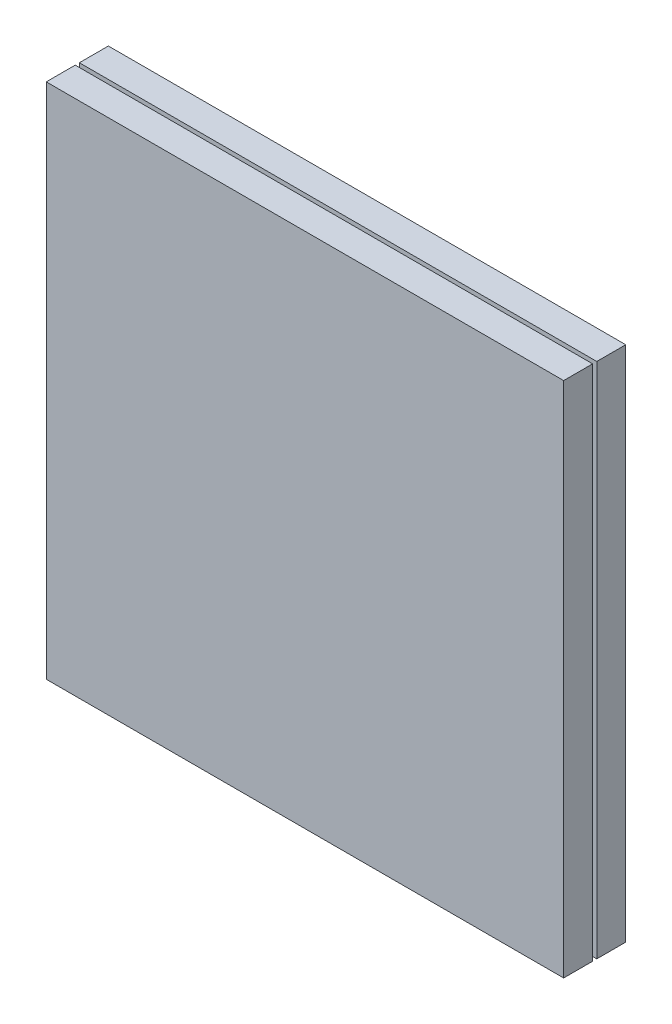
ISO-10303-21;
HEADER;
FILE_DESCRIPTION(('STEP AP214'),'2;1');
FILE_NAME('part.step','',(''),(''),'','','');
FILE_SCHEMA(('AUTOMOTIVE_DESIGN { 1 0 10303 214 1 1 1 1 }'));
ENDSEC;
DATA;
#1=APPLICATION_CONTEXT('core data for automotive mechanical design processes');
#2=APPLICATION_PROTOCOL_DEFINITION('international standard','automotive_design',2000,#1);
#3=PRODUCT_CONTEXT('',#1,'mechanical');
#4=PRODUCT('Part','Part','',(#3));
#5=PRODUCT_RELATED_PRODUCT_CATEGORY('part','',(#4));
#6=PRODUCT_DEFINITION_FORMATION('','',#4);
#7=PRODUCT_DEFINITION_CONTEXT('part definition',#1,'design');
#8=PRODUCT_DEFINITION('design','',#6,#7);
#9=PRODUCT_DEFINITION_SHAPE('','',#8);
#10=(LENGTH_UNIT() NAMED_UNIT(*) SI_UNIT(.MILLI.,.METRE.));
#11=(NAMED_UNIT(*) PLANE_ANGLE_UNIT() SI_UNIT($,.RADIAN.));
#12=(NAMED_UNIT(*) SI_UNIT($,.STERADIAN.) SOLID_ANGLE_UNIT());
#13=UNCERTAINTY_MEASURE_WITH_UNIT(LENGTH_MEASURE(1.E-05),#10,'distance_accuracy_value','');
#14=(GEOMETRIC_REPRESENTATION_CONTEXT(3) GLOBAL_UNCERTAINTY_ASSIGNED_CONTEXT((#13)) GLOBAL_UNIT_ASSIGNED_CONTEXT((#10,
#11,#12)) REPRESENTATION_CONTEXT('',''));
#15=CARTESIAN_POINT('',(0.,0.,0.));
#16=DIRECTION('',(0.,0.,1.));
#17=DIRECTION('',(1.,0.,0.));
#18=AXIS2_PLACEMENT_3D('',#15,#16,#17);
#19=CARTESIAN_POINT('',(6.25000000000001,-6.25,-0.7));
#20=DIRECTION('',(1.,0.,0.));
#21=DIRECTION('',(0.,0.,-1.));
#22=AXIS2_PLACEMENT_3D('',#19,#20,#21);
#23=PLANE('',#22);
#24=DIRECTION('',(0.,1.,0.));
#25=VECTOR('',#24,1.);
#26=CARTESIAN_POINT('',(6.25000000000001,-6.25,0.));
#27=LINE('',#26,#25);
#28=CARTESIAN_POINT('',(6.25000000000001,-6.25,0.));
#29=VERTEX_POINT('',#28);
#30=CARTESIAN_POINT('',(6.25000000000001,6.25,0.));
#31=VERTEX_POINT('',#30);
#32=EDGE_CURVE('E164',#29,#31,#27,.T.);
#33=ORIENTED_EDGE('',*,*,#32,.F.);
#34=DIRECTION('',(0.,0.,1.));
#35=VECTOR('',#34,1.);
#36=CARTESIAN_POINT('',(6.25000000000001,-6.25,-0.7));
#37=LINE('',#36,#35);
#38=CARTESIAN_POINT('',(6.25000000000001,-6.25,-0.7));
#39=VERTEX_POINT('',#38);
#40=EDGE_CURVE('E11',#39,#29,#37,.T.);
#41=ORIENTED_EDGE('',*,*,#40,.F.);
#42=DIRECTION('',(0.,1.,0.));
#43=VECTOR('',#42,1.);
#44=CARTESIAN_POINT('',(6.25000000000001,-6.25,-0.7));
#45=LINE('',#44,#43);
#46=CARTESIAN_POINT('',(6.25000000000001,6.25,-0.7));
#47=VERTEX_POINT('',#46);
#48=EDGE_CURVE('E165',#39,#47,#45,.T.);
#49=ORIENTED_EDGE('',*,*,#48,.T.);
#50=DIRECTION('',(0.,0.,1.));
#51=VECTOR('',#50,1.);
#52=CARTESIAN_POINT('',(6.25000000000001,6.25,-0.7));
#53=LINE('',#52,#51);
#54=EDGE_CURVE('E19',#47,#31,#53,.T.);
#55=ORIENTED_EDGE('',*,*,#54,.T.);
#56=EDGE_LOOP('',(#33,#41,#49,#55));
#57=FACE_BOUND('',#56,.T.);
#58=ADVANCED_FACE('F16',(#57),#23,.T.);
#59=CARTESIAN_POINT('',(-6.24999999999998,-6.25,-0.7));
#60=DIRECTION('',(0.,-1.,0.));
#61=DIRECTION('',(0.,0.,-1.));
#62=AXIS2_PLACEMENT_3D('',#59,#60,#61);
#63=PLANE('',#62);
#64=DIRECTION('',(1.,0.,0.));
#65=VECTOR('',#64,1.);
#66=CARTESIAN_POINT('',(-6.24999999999998,-6.25,0.));
#67=LINE('',#66,#65);
#68=CARTESIAN_POINT('',(-6.24999999999998,-6.25,0.));
#69=VERTEX_POINT('',#68);
#70=EDGE_CURVE('E169',#69,#29,#67,.T.);
#71=ORIENTED_EDGE('',*,*,#70,.F.);
#72=DIRECTION('',(0.,0.,1.));
#73=VECTOR('',#72,1.);
#74=CARTESIAN_POINT('',(-6.24999999999998,-6.25,-0.7));
#75=LINE('',#74,#73);
#76=CARTESIAN_POINT('',(-6.24999999999998,-6.25,-0.7));
#77=VERTEX_POINT('',#76);
#78=EDGE_CURVE('E24',#77,#69,#75,.T.);
#79=ORIENTED_EDGE('',*,*,#78,.F.);
#80=DIRECTION('',(1.,0.,0.));
#81=VECTOR('',#80,1.);
#82=CARTESIAN_POINT('',(-6.24999999999998,-6.25,-0.7));
#83=LINE('',#82,#81);
#84=EDGE_CURVE('E175',#77,#39,#83,.T.);
#85=ORIENTED_EDGE('',*,*,#84,.T.);
#86=ORIENTED_EDGE('',*,*,#40,.T.);
#87=EDGE_LOOP('',(#71,#79,#85,#86));
#88=FACE_BOUND('',#87,.T.);
#89=ADVANCED_FACE('F201',(#88),#63,.T.);
#90=CARTESIAN_POINT('',(-6.24999999999998,-6.25,-0.7));
#91=DIRECTION('',(-1.,0.,0.));
#92=DIRECTION('',(0.,0.,1.));
#93=AXIS2_PLACEMENT_3D('',#90,#91,#92);
#94=PLANE('',#93);
#95=DIRECTION('',(0.,-1.,0.));
#96=VECTOR('',#95,1.);
#97=CARTESIAN_POINT('',(-6.24999999999998,-6.25,0.));
#98=LINE('',#97,#96);
#99=CARTESIAN_POINT('',(-6.24999999999998,6.25,0.));
#100=VERTEX_POINT('',#99);
#101=EDGE_CURVE('E183',#100,#69,#98,.T.);
#102=ORIENTED_EDGE('',*,*,#101,.F.);
#103=DIRECTION('',(0.,0.,1.));
#104=VECTOR('',#103,1.);
#105=CARTESIAN_POINT('',(-6.24999999999998,6.25,-0.7));
#106=LINE('',#105,#104);
#107=CARTESIAN_POINT('',(-6.24999999999998,6.25,-0.7));
#108=VERTEX_POINT('',#107);
#109=EDGE_CURVE('E188',#108,#100,#106,.T.);
#110=ORIENTED_EDGE('',*,*,#109,.F.);
#111=DIRECTION('',(0.,-1.,0.));
#112=VECTOR('',#111,1.);
#113=CARTESIAN_POINT('',(-6.24999999999998,-6.25,-0.7));
#114=LINE('',#113,#112);
#115=EDGE_CURVE('E172',#108,#77,#114,.T.);
#116=ORIENTED_EDGE('',*,*,#115,.T.);
#117=ORIENTED_EDGE('',*,*,#78,.T.);
#118=EDGE_LOOP('',(#102,#110,#116,#117));
#119=FACE_BOUND('',#118,.T.);
#120=ADVANCED_FACE('F207',(#119),#94,.T.);
#121=CARTESIAN_POINT('',(-6.24999999999998,6.25,-0.7));
#122=DIRECTION('',(0.,1.,0.));
#123=DIRECTION('',(0.,0.,1.));
#124=AXIS2_PLACEMENT_3D('',#121,#122,#123);
#125=PLANE('',#124);
#126=DIRECTION('',(-1.,0.,0.));
#127=VECTOR('',#126,1.);
#128=CARTESIAN_POINT('',(-6.24999999999998,6.25,0.));
#129=LINE('',#128,#127);
#130=EDGE_CURVE('E180',#31,#100,#129,.T.);
#131=ORIENTED_EDGE('',*,*,#130,.F.);
#132=ORIENTED_EDGE('',*,*,#54,.F.);
#133=DIRECTION('',(-1.,0.,0.));
#134=VECTOR('',#133,1.);
#135=CARTESIAN_POINT('',(-6.24999999999998,6.25,-0.7));
#136=LINE('',#135,#134);
#137=EDGE_CURVE('E168',#47,#108,#136,.T.);
#138=ORIENTED_EDGE('',*,*,#137,.T.);
#139=ORIENTED_EDGE('',*,*,#109,.T.);
#140=EDGE_LOOP('',(#131,#132,#138,#139));
#141=FACE_BOUND('',#140,.T.);
#142=ADVANCED_FACE('F196',(#141),#125,.T.);
#143=CARTESIAN_POINT('',(0.,0.,-0.7));
#144=DIRECTION('',(0.,0.,-1.));
#145=DIRECTION('',(-1.,0.,0.));
#146=AXIS2_PLACEMENT_3D('',#143,#144,#145);
#147=PLANE('',#146);
#148=DIRECTION('',(0.,1.,0.));
#149=VECTOR('',#148,1.);
#150=CARTESIAN_POINT('',(-5.25,-5.25,-0.7));
#151=LINE('',#150,#149);
#152=CARTESIAN_POINT('',(-5.25,-5.25,-0.7));
#153=VERTEX_POINT('',#152);
#154=CARTESIAN_POINT('',(-5.25,5.25,-0.7));
#155=VERTEX_POINT('',#154);
#156=EDGE_CURVE('E32',#153,#155,#151,.T.);
#157=ORIENTED_EDGE('',*,*,#156,.F.);
#158=DIRECTION('',(-1.,0.,0.));
#159=VECTOR('',#158,1.);
#160=CARTESIAN_POINT('',(5.25,-5.25,-0.7));
#161=LINE('',#160,#159);
#162=CARTESIAN_POINT('',(5.25,-5.25,-0.7));
#163=VERTEX_POINT('',#162);
#164=EDGE_CURVE('E36',#163,#153,#161,.T.);
#165=ORIENTED_EDGE('',*,*,#164,.F.);
#166=DIRECTION('',(0.,-1.,0.));
#167=VECTOR('',#166,1.);
#168=CARTESIAN_POINT('',(5.25,-5.25,-0.7));
#169=LINE('',#168,#167);
#170=CARTESIAN_POINT('',(5.25,5.25,-0.7));
#171=VERTEX_POINT('',#170);
#172=EDGE_CURVE('E150',#171,#163,#169,.T.);
#173=ORIENTED_EDGE('',*,*,#172,.F.);
#174=DIRECTION('',(1.,0.,0.));
#175=VECTOR('',#174,1.);
#176=CARTESIAN_POINT('',(5.25,5.25,-0.7));
#177=LINE('',#176,#175);
#178=EDGE_CURVE('E129',#155,#171,#177,.T.);
#179=ORIENTED_EDGE('',*,*,#178,.F.);
#180=EDGE_LOOP('',(#157,#165,#173,#179));
#181=FACE_BOUND('',#180,.T.);
#182=ORIENTED_EDGE('',*,*,#48,.F.);
#183=ORIENTED_EDGE('',*,*,#84,.F.);
#184=ORIENTED_EDGE('',*,*,#115,.F.);
#185=ORIENTED_EDGE('',*,*,#137,.F.);
#186=EDGE_LOOP('',(#182,#183,#184,#185));
#187=FACE_BOUND('',#186,.T.);
#188=ADVANCED_FACE('F204',(#181,#187),#147,.T.);
#189=CARTESIAN_POINT('',(0.,0.,0.));
#190=DIRECTION('',(0.,0.,-1.));
#191=DIRECTION('',(-1.,0.,0.));
#192=AXIS2_PLACEMENT_3D('',#189,#190,#191);
#193=PLANE('',#192);
#194=ORIENTED_EDGE('',*,*,#32,.T.);
#195=ORIENTED_EDGE('',*,*,#130,.T.);
#196=ORIENTED_EDGE('',*,*,#101,.T.);
#197=ORIENTED_EDGE('',*,*,#70,.T.);
#198=EDGE_LOOP('',(#194,#195,#196,#197));
#199=FACE_BOUND('',#198,.T.);
#200=ADVANCED_FACE('F198',(#199),#193,.F.);
#201=CARTESIAN_POINT('',(-5.25,-5.25,-0.8));
#202=DIRECTION('',(1.,0.,0.));
#203=DIRECTION('',(0.,0.,-1.));
#204=AXIS2_PLACEMENT_3D('',#201,#202,#203);
#205=PLANE('',#204);
#206=ORIENTED_EDGE('',*,*,#156,.T.);
#207=DIRECTION('',(0.,0.,1.));
#208=VECTOR('',#207,1.);
#209=CARTESIAN_POINT('',(-5.25,5.25,-0.8));
#210=LINE('',#209,#208);
#211=CARTESIAN_POINT('',(-5.25,5.25,-0.8));
#212=VERTEX_POINT('',#211);
#213=EDGE_CURVE('E161',#212,#155,#210,.T.);
#214=ORIENTED_EDGE('',*,*,#213,.F.);
#215=DIRECTION('',(0.,1.,0.));
#216=VECTOR('',#215,1.);
#217=CARTESIAN_POINT('',(-5.25,-5.25,-0.8));
#218=LINE('',#217,#216);
#219=CARTESIAN_POINT('',(-5.25,-5.25,-0.8));
#220=VERTEX_POINT('',#219);
#221=EDGE_CURVE('E135',#220,#212,#218,.T.);
#222=ORIENTED_EDGE('',*,*,#221,.F.);
#223=DIRECTION('',(0.,0.,1.));
#224=VECTOR('',#223,1.);
#225=CARTESIAN_POINT('',(-5.25,-5.25,-0.8));
#226=LINE('',#225,#224);
#227=EDGE_CURVE('E146',#220,#153,#226,.T.);
#228=ORIENTED_EDGE('',*,*,#227,.T.);
#229=EDGE_LOOP('',(#206,#214,#222,#228));
#230=FACE_BOUND('',#229,.T.);
#231=ADVANCED_FACE('F258',(#230),#205,.F.);
#232=CARTESIAN_POINT('',(5.25,5.25,-0.8));
#233=DIRECTION('',(0.,-1.,0.));
#234=DIRECTION('',(0.,0.,-1.));
#235=AXIS2_PLACEMENT_3D('',#232,#233,#234);
#236=PLANE('',#235);
#237=ORIENTED_EDGE('',*,*,#178,.T.);
#238=DIRECTION('',(0.,0.,1.));
#239=VECTOR('',#238,1.);
#240=CARTESIAN_POINT('',(5.25,5.25,-0.8));
#241=LINE('',#240,#239);
#242=CARTESIAN_POINT('',(5.25,5.25,-0.8));
#243=VERTEX_POINT('',#242);
#244=EDGE_CURVE('E158',#243,#171,#241,.T.);
#245=ORIENTED_EDGE('',*,*,#244,.F.);
#246=DIRECTION('',(1.,0.,0.));
#247=VECTOR('',#246,1.);
#248=CARTESIAN_POINT('',(5.25,5.25,-0.8));
#249=LINE('',#248,#247);
#250=EDGE_CURVE('E138',#212,#243,#249,.T.);
#251=ORIENTED_EDGE('',*,*,#250,.F.);
#252=ORIENTED_EDGE('',*,*,#213,.T.);
#253=EDGE_LOOP('',(#237,#245,#251,#252));
#254=FACE_BOUND('',#253,.T.);
#255=ADVANCED_FACE('F266',(#254),#236,.F.);
#256=CARTESIAN_POINT('',(5.25,-5.25,-0.8));
#257=DIRECTION('',(-1.,0.,0.));
#258=DIRECTION('',(0.,0.,1.));
#259=AXIS2_PLACEMENT_3D('',#256,#257,#258);
#260=PLANE('',#259);
#261=ORIENTED_EDGE('',*,*,#172,.T.);
#262=DIRECTION('',(0.,0.,1.));
#263=VECTOR('',#262,1.);
#264=CARTESIAN_POINT('',(5.25,-5.25,-0.8));
#265=LINE('',#264,#263);
#266=CARTESIAN_POINT('',(5.25,-5.25,-0.8));
#267=VERTEX_POINT('',#266);
#268=EDGE_CURVE('E155',#267,#163,#265,.T.);
#269=ORIENTED_EDGE('',*,*,#268,.F.);
#270=DIRECTION('',(0.,-1.,0.));
#271=VECTOR('',#270,1.);
#272=CARTESIAN_POINT('',(5.25,-5.25,-0.8));
#273=LINE('',#272,#271);
#274=EDGE_CURVE('E141',#243,#267,#273,.T.);
#275=ORIENTED_EDGE('',*,*,#274,.F.);
#276=ORIENTED_EDGE('',*,*,#244,.T.);
#277=EDGE_LOOP('',(#261,#269,#275,#276));
#278=FACE_BOUND('',#277,.T.);
#279=ADVANCED_FACE('F276',(#278),#260,.F.);
#280=CARTESIAN_POINT('',(5.25,-5.25,-0.8));
#281=DIRECTION('',(0.,1.,0.));
#282=DIRECTION('',(0.,0.,1.));
#283=AXIS2_PLACEMENT_3D('',#280,#281,#282);
#284=PLANE('',#283);
#285=ORIENTED_EDGE('',*,*,#164,.T.);
#286=ORIENTED_EDGE('',*,*,#227,.F.);
#287=DIRECTION('',(-1.,0.,0.));
#288=VECTOR('',#287,1.);
#289=CARTESIAN_POINT('',(5.25,-5.25,-0.8));
#290=LINE('',#289,#288);
#291=EDGE_CURVE('E144',#267,#220,#290,.T.);
#292=ORIENTED_EDGE('',*,*,#291,.F.);
#293=ORIENTED_EDGE('',*,*,#268,.T.);
#294=EDGE_LOOP('',(#285,#286,#292,#293));
#295=FACE_BOUND('',#294,.T.);
#296=ADVANCED_FACE('F286',(#295),#284,.F.);
#297=CARTESIAN_POINT('',(-6.24999999999998,-6.25,-1.5));
#298=DIRECTION('',(1.,0.,0.));
#299=DIRECTION('',(0.,0.,-1.));
#300=AXIS2_PLACEMENT_3D('',#297,#298,#299);
#301=PLANE('',#300);
#302=DIRECTION('',(0.,1.,0.));
#303=VECTOR('',#302,1.);
#304=CARTESIAN_POINT('',(-6.24999999999998,-6.25,-0.8));
#305=LINE('',#304,#303);
#306=CARTESIAN_POINT('',(-6.24999999999998,-6.25,-0.8));
#307=VERTEX_POINT('',#306);
#308=CARTESIAN_POINT('',(-6.24999999999998,6.25,-0.8));
#309=VERTEX_POINT('',#308);
#310=EDGE_CURVE('E127',#307,#309,#305,.T.);
#311=ORIENTED_EDGE('',*,*,#310,.T.);
#312=DIRECTION('',(0.,0.,1.));
#313=VECTOR('',#312,1.);
#314=CARTESIAN_POINT('',(-6.24999999999998,6.25,-1.5));
#315=LINE('',#314,#313);
#316=CARTESIAN_POINT('',(-6.24999999999998,6.25,-1.5));
#317=VERTEX_POINT('',#316);
#318=EDGE_CURVE('E107',#317,#309,#315,.T.);
#319=ORIENTED_EDGE('',*,*,#318,.F.);
#320=DIRECTION('',(0.,1.,0.));
#321=VECTOR('',#320,1.);
#322=CARTESIAN_POINT('',(-6.24999999999998,-6.25,-1.5));
#323=LINE('',#322,#321);
#324=CARTESIAN_POINT('',(-6.24999999999998,-6.25,-1.5));
#325=VERTEX_POINT('',#324);
#326=EDGE_CURVE('E114',#325,#317,#323,.T.);
#327=ORIENTED_EDGE('',*,*,#326,.F.);
#328=DIRECTION('',(0.,0.,1.));
#329=VECTOR('',#328,1.);
#330=CARTESIAN_POINT('',(-6.24999999999998,-6.25,-1.5));
#331=LINE('',#330,#329);
#332=EDGE_CURVE('E368',#325,#307,#331,.T.);
#333=ORIENTED_EDGE('',*,*,#332,.T.);
#334=EDGE_LOOP('',(#311,#319,#327,#333));
#335=FACE_BOUND('',#334,.T.);
#336=ADVANCED_FACE('F125',(#335),#301,.F.);
#337=CARTESIAN_POINT('',(6.24999999999998,6.25,-1.5));
#338=DIRECTION('',(0.,-1.,0.));
#339=DIRECTION('',(0.,0.,-1.));
#340=AXIS2_PLACEMENT_3D('',#337,#338,#339);
#341=PLANE('',#340);
#342=DIRECTION('',(1.,0.,0.));
#343=VECTOR('',#342,1.);
#344=CARTESIAN_POINT('',(6.24999999999998,6.25,-0.8));
#345=LINE('',#344,#343);
#346=CARTESIAN_POINT('',(6.24999999999998,6.25,-0.8));
#347=VERTEX_POINT('',#346);
#348=EDGE_CURVE('E359',#309,#347,#345,.T.);
#349=ORIENTED_EDGE('',*,*,#348,.T.);
#350=DIRECTION('',(0.,0.,1.));
#351=VECTOR('',#350,1.);
#352=CARTESIAN_POINT('',(6.24999999999998,6.25,-1.5));
#353=LINE('',#352,#351);
#354=CARTESIAN_POINT('',(6.24999999999998,6.25,-1.5));
#355=VERTEX_POINT('',#354);
#356=EDGE_CURVE('E110',#355,#347,#353,.T.);
#357=ORIENTED_EDGE('',*,*,#356,.F.);
#358=DIRECTION('',(1.,0.,0.));
#359=VECTOR('',#358,1.);
#360=CARTESIAN_POINT('',(6.24999999999998,6.25,-1.5));
#361=LINE('',#360,#359);
#362=EDGE_CURVE('E103',#317,#355,#361,.T.);
#363=ORIENTED_EDGE('',*,*,#362,.F.);
#364=ORIENTED_EDGE('',*,*,#318,.T.);
#365=EDGE_LOOP('',(#349,#357,#363,#364));
#366=FACE_BOUND('',#365,.T.);
#367=ADVANCED_FACE('F105',(#366),#341,.F.);
#368=CARTESIAN_POINT('',(6.24999999999998,-6.25,-1.5));
#369=DIRECTION('',(-1.,0.,0.));
#370=DIRECTION('',(0.,0.,1.));
#371=AXIS2_PLACEMENT_3D('',#368,#369,#370);
#372=PLANE('',#371);
#373=DIRECTION('',(0.,-1.,0.));
#374=VECTOR('',#373,1.);
#375=CARTESIAN_POINT('',(6.24999999999998,-6.25,-0.8));
#376=LINE('',#375,#374);
#377=CARTESIAN_POINT('',(6.24999999999998,-6.25,-0.8));
#378=VERTEX_POINT('',#377);
#379=EDGE_CURVE('E361',#347,#378,#376,.T.);
#380=ORIENTED_EDGE('',*,*,#379,.T.);
#381=DIRECTION('',(0.,0.,1.));
#382=VECTOR('',#381,1.);
#383=CARTESIAN_POINT('',(6.24999999999998,-6.25,-1.5));
#384=LINE('',#383,#382);
#385=CARTESIAN_POINT('',(6.24999999999998,-6.25,-1.5));
#386=VERTEX_POINT('',#385);
#387=EDGE_CURVE('E131',#386,#378,#384,.T.);
#388=ORIENTED_EDGE('',*,*,#387,.F.);
#389=DIRECTION('',(0.,-1.,0.));
#390=VECTOR('',#389,1.);
#391=CARTESIAN_POINT('',(6.24999999999998,-6.25,-1.5));
#392=LINE('',#391,#390);
#393=EDGE_CURVE('E113',#355,#386,#392,.T.);
#394=ORIENTED_EDGE('',*,*,#393,.F.);
#395=ORIENTED_EDGE('',*,*,#356,.T.);
#396=EDGE_LOOP('',(#380,#388,#394,#395));
#397=FACE_BOUND('',#396,.T.);
#398=ADVANCED_FACE('F313',(#397),#372,.F.);
#399=CARTESIAN_POINT('',(6.24999999999998,-6.25,-1.5));
#400=DIRECTION('',(0.,1.,0.));
#401=DIRECTION('',(0.,0.,1.));
#402=AXIS2_PLACEMENT_3D('',#399,#400,#401);
#403=PLANE('',#402);
#404=DIRECTION('',(-1.,0.,0.));
#405=VECTOR('',#404,1.);
#406=CARTESIAN_POINT('',(6.24999999999998,-6.25,-0.8));
#407=LINE('',#406,#405);
#408=EDGE_CURVE('E123',#378,#307,#407,.T.);
#409=ORIENTED_EDGE('',*,*,#408,.T.);
#410=ORIENTED_EDGE('',*,*,#332,.F.);
#411=DIRECTION('',(-1.,0.,0.));
#412=VECTOR('',#411,1.);
#413=CARTESIAN_POINT('',(6.24999999999998,-6.25,-1.5));
#414=LINE('',#413,#412);
#415=EDGE_CURVE('E119',#386,#325,#414,.T.);
#416=ORIENTED_EDGE('',*,*,#415,.F.);
#417=ORIENTED_EDGE('',*,*,#387,.T.);
#418=EDGE_LOOP('',(#409,#410,#416,#417));
#419=FACE_BOUND('',#418,.T.);
#420=ADVANCED_FACE('F322',(#419),#403,.F.);
#421=CARTESIAN_POINT('',(0.,0.,-1.5));
#422=DIRECTION('',(0.,0.,1.));
#423=DIRECTION('',(1.,0.,0.));
#424=AXIS2_PLACEMENT_3D('',#421,#422,#423);
#425=PLANE('',#424);
#426=ORIENTED_EDGE('',*,*,#326,.T.);
#427=ORIENTED_EDGE('',*,*,#362,.T.);
#428=ORIENTED_EDGE('',*,*,#393,.T.);
#429=ORIENTED_EDGE('',*,*,#415,.T.);
#430=EDGE_LOOP('',(#426,#427,#428,#429));
#431=FACE_BOUND('',#430,.T.);
#432=ADVANCED_FACE('F117',(#431),#425,.F.);
#433=CARTESIAN_POINT('',(0.,0.,-0.8));
#434=DIRECTION('',(0.,0.,1.));
#435=DIRECTION('',(1.,0.,0.));
#436=AXIS2_PLACEMENT_3D('',#433,#434,#435);
#437=PLANE('',#436);
#438=ORIENTED_EDGE('',*,*,#291,.T.);
#439=ORIENTED_EDGE('',*,*,#221,.T.);
#440=ORIENTED_EDGE('',*,*,#250,.T.);
#441=ORIENTED_EDGE('',*,*,#274,.T.);
#442=EDGE_LOOP('',(#438,#439,#440,#441));
#443=FACE_BOUND('',#442,.T.);
#444=ORIENTED_EDGE('',*,*,#310,.F.);
#445=ORIENTED_EDGE('',*,*,#408,.F.);
#446=ORIENTED_EDGE('',*,*,#379,.F.);
#447=ORIENTED_EDGE('',*,*,#348,.F.);
#448=EDGE_LOOP('',(#444,#445,#446,#447));
#449=FACE_BOUND('',#448,.T.);
#450=ADVANCED_FACE('F341',(#443,#449),#437,.T.);
#451=CLOSED_SHELL('',(#58,#89,#120,#142,#188,#200,#231,#255,#279,#296,#336,#367,#398,#420,#432,#450));
#452=MANIFOLD_SOLID_BREP('B1',#451);
#453=ADVANCED_BREP_SHAPE_REPRESENTATION('',(#18,#452),#14);
#454=SHAPE_DEFINITION_REPRESENTATION(#9,#453);
ENDSEC;
END-ISO-10303-21;
